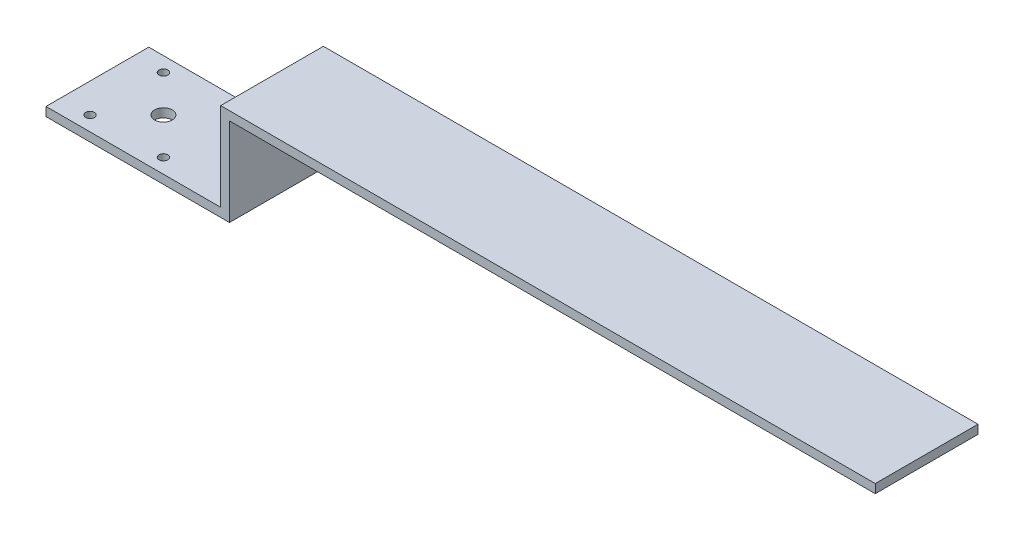
ISO-10303-21;
HEADER;
FILE_DESCRIPTION(('STEP AP214'),'2;1');
FILE_NAME('part.step','',(''),(''),'','','');
FILE_SCHEMA(('AUTOMOTIVE_DESIGN { 1 0 10303 214 1 1 1 1 }'));
ENDSEC;
DATA;
#1=APPLICATION_CONTEXT('core data for automotive mechanical design processes');
#2=APPLICATION_PROTOCOL_DEFINITION('international standard','automotive_design',2000,#1);
#3=PRODUCT_CONTEXT('',#1,'mechanical');
#4=PRODUCT('Part','Part','',(#3));
#5=PRODUCT_RELATED_PRODUCT_CATEGORY('part','',(#4));
#6=PRODUCT_DEFINITION_FORMATION('','',#4);
#7=PRODUCT_DEFINITION_CONTEXT('part definition',#1,'design');
#8=PRODUCT_DEFINITION('design','',#6,#7);
#9=PRODUCT_DEFINITION_SHAPE('','',#8);
#10=(LENGTH_UNIT() NAMED_UNIT(*) SI_UNIT(.MILLI.,.METRE.));
#11=(NAMED_UNIT(*) PLANE_ANGLE_UNIT() SI_UNIT($,.RADIAN.));
#12=(NAMED_UNIT(*) SI_UNIT($,.STERADIAN.) SOLID_ANGLE_UNIT());
#13=UNCERTAINTY_MEASURE_WITH_UNIT(LENGTH_MEASURE(1.E-05),#10,'distance_accuracy_value','');
#14=(GEOMETRIC_REPRESENTATION_CONTEXT(3) GLOBAL_UNCERTAINTY_ASSIGNED_CONTEXT((#13)) GLOBAL_UNIT_ASSIGNED_CONTEXT((#10,
#11,#12)) REPRESENTATION_CONTEXT('',''));
#15=CARTESIAN_POINT('',(0.,0.,0.));
#16=DIRECTION('',(0.,0.,1.));
#17=DIRECTION('',(1.,0.,0.));
#18=AXIS2_PLACEMENT_3D('',#15,#16,#17);
#19=CARTESIAN_POINT('',(31.25,3.,-17.5));
#20=DIRECTION('',(-1.,0.,0.));
#21=DIRECTION('',(0.,0.,1.));
#22=AXIS2_PLACEMENT_3D('',#19,#20,#21);
#23=PLANE('',#22);
#24=DIRECTION('',(0.,0.,-1.));
#25=VECTOR('',#24,1.);
#26=CARTESIAN_POINT('',(31.25,30.,17.5));
#27=LINE('',#26,#25);
#28=CARTESIAN_POINT('',(31.25,30.,17.5));
#29=VERTEX_POINT('',#28);
#30=CARTESIAN_POINT('',(31.25,30.,-17.5));
#31=VERTEX_POINT('',#30);
#32=EDGE_CURVE('E47',#29,#31,#27,.T.);
#33=ORIENTED_EDGE('',*,*,#32,.F.);
#34=DIRECTION('',(0.,-1.,0.));
#35=VECTOR('',#34,1.);
#36=CARTESIAN_POINT('',(31.25,3.,17.5));
#37=LINE('',#36,#35);
#38=CARTESIAN_POINT('',(31.25,0.,17.5));
#39=VERTEX_POINT('',#38);
#40=EDGE_CURVE('E119',#29,#39,#37,.T.);
#41=ORIENTED_EDGE('',*,*,#40,.T.);
#42=DIRECTION('',(0.,0.,-1.));
#43=VECTOR('',#42,1.);
#44=CARTESIAN_POINT('',(31.25,0.,-17.5));
#45=LINE('',#44,#43);
#46=CARTESIAN_POINT('',(31.25,0.,-17.5));
#47=VERTEX_POINT('',#46);
#48=EDGE_CURVE('E165',#39,#47,#45,.T.);
#49=ORIENTED_EDGE('',*,*,#48,.T.);
#50=DIRECTION('',(0.,-1.,0.));
#51=VECTOR('',#50,1.);
#52=CARTESIAN_POINT('',(31.25,3.,-17.5));
#53=LINE('',#52,#51);
#54=EDGE_CURVE('E11',#31,#47,#53,.T.);
#55=ORIENTED_EDGE('',*,*,#54,.F.);
#56=EDGE_LOOP('',(#33,#41,#49,#55));
#57=FACE_BOUND('',#56,.T.);
#58=ADVANCED_FACE('F33',(#57),#23,.F.);
#59=CARTESIAN_POINT('',(0.,3.,0.));
#60=DIRECTION('',(0.,1.,0.));
#61=DIRECTION('',(0.,0.,1.));
#62=AXIS2_PLACEMENT_3D('',#59,#60,#61);
#63=PLANE('',#62);
#64=DIRECTION('',(0.,0.,1.));
#65=VECTOR('',#64,1.);
#66=CARTESIAN_POINT('',(28.25,3.,-17.5));
#67=LINE('',#66,#65);
#68=CARTESIAN_POINT('',(28.25,3.,-17.5));
#69=VERTEX_POINT('',#68);
#70=CARTESIAN_POINT('',(28.25,3.,17.5));
#71=VERTEX_POINT('',#70);
#72=EDGE_CURVE('E55',#69,#71,#67,.T.);
#73=ORIENTED_EDGE('',*,*,#72,.F.);
#74=DIRECTION('',(-1.,0.,0.));
#75=VECTOR('',#74,1.);
#76=CARTESIAN_POINT('',(-31.25,3.,-17.5));
#77=LINE('',#76,#75);
#78=CARTESIAN_POINT('',(-31.25,3.,-17.5));
#79=VERTEX_POINT('',#78);
#80=EDGE_CURVE('E168',#69,#79,#77,.T.);
#81=ORIENTED_EDGE('',*,*,#80,.T.);
#82=DIRECTION('',(0.,0.,1.));
#83=VECTOR('',#82,1.);
#84=CARTESIAN_POINT('',(-31.25,3.,-17.5));
#85=LINE('',#84,#83);
#86=CARTESIAN_POINT('',(-31.25,3.,17.5));
#87=VERTEX_POINT('',#86);
#88=EDGE_CURVE('E170',#79,#87,#85,.T.);
#89=ORIENTED_EDGE('',*,*,#88,.T.);
#90=DIRECTION('',(1.,0.,0.));
#91=VECTOR('',#90,1.);
#92=CARTESIAN_POINT('',(-31.25,3.,17.5));
#93=LINE('',#92,#91);
#94=EDGE_CURVE('E173',#87,#71,#93,.T.);
#95=ORIENTED_EDGE('',*,*,#94,.T.);
#96=EDGE_LOOP('',(#73,#81,#89,#95));
#97=FACE_BOUND('',#96,.T.);
#98=CARTESIAN_POINT('',(3.75000000000001,3.,12.5));
#99=DIRECTION('',(0.,1.,0.));
#100=DIRECTION('',(0.,0.,1.));
#101=AXIS2_PLACEMENT_3D('',#98,#99,#100);
#102=CIRCLE('',#101,1.5);
#103=CARTESIAN_POINT('',(3.75000000000001,3.,14.));
#104=VERTEX_POINT('',#103);
#105=EDGE_CURVE('E144',#104,#104,#102,.T.);
#106=ORIENTED_EDGE('',*,*,#105,.F.);
#107=EDGE_LOOP('',(#106));
#108=FACE_BOUND('',#107,.T.);
#109=CARTESIAN_POINT('',(-21.25,3.,12.5));
#110=DIRECTION('',(0.,1.,0.));
#111=DIRECTION('',(0.,0.,1.));
#112=AXIS2_PLACEMENT_3D('',#109,#110,#111);
#113=CIRCLE('',#112,1.5);
#114=CARTESIAN_POINT('',(-21.25,3.,14.));
#115=VERTEX_POINT('',#114);
#116=EDGE_CURVE('E156',#115,#115,#113,.T.);
#117=ORIENTED_EDGE('',*,*,#116,.F.);
#118=EDGE_LOOP('',(#117));
#119=FACE_BOUND('',#118,.T.);
#120=CARTESIAN_POINT('',(-21.25,3.,-12.5));
#121=DIRECTION('',(0.,1.,0.));
#122=DIRECTION('',(0.,0.,1.));
#123=AXIS2_PLACEMENT_3D('',#120,#121,#122);
#124=CIRCLE('',#123,1.5);
#125=CARTESIAN_POINT('',(-21.25,3.,-11.));
#126=VERTEX_POINT('',#125);
#127=EDGE_CURVE('E162',#126,#126,#124,.T.);
#128=ORIENTED_EDGE('',*,*,#127,.F.);
#129=EDGE_LOOP('',(#128));
#130=FACE_BOUND('',#129,.T.);
#131=CARTESIAN_POINT('',(3.75,3.,-12.5));
#132=DIRECTION('',(0.,1.,0.));
#133=DIRECTION('',(0.,0.,1.));
#134=AXIS2_PLACEMENT_3D('',#131,#132,#133);
#135=CIRCLE('',#134,1.5);
#136=CARTESIAN_POINT('',(3.75,3.,-11.));
#137=VERTEX_POINT('',#136);
#138=EDGE_CURVE('E150',#137,#137,#135,.T.);
#139=ORIENTED_EDGE('',*,*,#138,.F.);
#140=EDGE_LOOP('',(#139));
#141=FACE_BOUND('',#140,.T.);
#142=CARTESIAN_POINT('',(-8.75,3.,0.));
#143=DIRECTION('',(0.,1.,0.));
#144=DIRECTION('',(0.,0.,1.));
#145=AXIS2_PLACEMENT_3D('',#142,#143,#144);
#146=CIRCLE('',#145,3.00000000000001);
#147=CARTESIAN_POINT('',(-8.75,3.,3.00000000000001));
#148=VERTEX_POINT('',#147);
#149=EDGE_CURVE('E138',#148,#148,#146,.T.);
#150=ORIENTED_EDGE('',*,*,#149,.F.);
#151=EDGE_LOOP('',(#150));
#152=FACE_BOUND('',#151,.T.);
#153=ADVANCED_FACE('F201',(#97,#108,#119,#130,#141,#152),#63,.T.);
#154=CARTESIAN_POINT('',(0.,0.,0.));
#155=DIRECTION('',(0.,1.,0.));
#156=DIRECTION('',(0.,0.,1.));
#157=AXIS2_PLACEMENT_3D('',#154,#155,#156);
#158=PLANE('',#157);
#159=ORIENTED_EDGE('',*,*,#48,.F.);
#160=DIRECTION('',(1.,0.,0.));
#161=VECTOR('',#160,1.);
#162=CARTESIAN_POINT('',(-31.25,0.,17.5));
#163=LINE('',#162,#161);
#164=CARTESIAN_POINT('',(-31.25,0.,17.5));
#165=VERTEX_POINT('',#164);
#166=EDGE_CURVE('E171',#165,#39,#163,.T.);
#167=ORIENTED_EDGE('',*,*,#166,.F.);
#168=DIRECTION('',(0.,0.,1.));
#169=VECTOR('',#168,1.);
#170=CARTESIAN_POINT('',(-31.25,0.,-17.5));
#171=LINE('',#170,#169);
#172=CARTESIAN_POINT('',(-31.25,0.,-17.5));
#173=VERTEX_POINT('',#172);
#174=EDGE_CURVE('E179',#173,#165,#171,.T.);
#175=ORIENTED_EDGE('',*,*,#174,.F.);
#176=DIRECTION('',(-1.,0.,0.));
#177=VECTOR('',#176,1.);
#178=CARTESIAN_POINT('',(-31.25,0.,-17.5));
#179=LINE('',#178,#177);
#180=EDGE_CURVE('E177',#47,#173,#179,.T.);
#181=ORIENTED_EDGE('',*,*,#180,.F.);
#182=EDGE_LOOP('',(#159,#167,#175,#181));
#183=FACE_BOUND('',#182,.T.);
#184=CARTESIAN_POINT('',(-21.25,0.,-12.5));
#185=DIRECTION('',(0.,1.,0.));
#186=DIRECTION('',(0.,0.,1.));
#187=AXIS2_PLACEMENT_3D('',#184,#185,#186);
#188=CIRCLE('',#187,1.5);
#189=CARTESIAN_POINT('',(-21.25,0.,-11.));
#190=VERTEX_POINT('',#189);
#191=EDGE_CURVE('E159',#190,#190,#188,.T.);
#192=ORIENTED_EDGE('',*,*,#191,.T.);
#193=EDGE_LOOP('',(#192));
#194=FACE_BOUND('',#193,.T.);
#195=CARTESIAN_POINT('',(-21.25,0.,12.5));
#196=DIRECTION('',(0.,1.,0.));
#197=DIRECTION('',(0.,0.,1.));
#198=AXIS2_PLACEMENT_3D('',#195,#196,#197);
#199=CIRCLE('',#198,1.5);
#200=CARTESIAN_POINT('',(-21.25,0.,14.));
#201=VERTEX_POINT('',#200);
#202=EDGE_CURVE('E153',#201,#201,#199,.T.);
#203=ORIENTED_EDGE('',*,*,#202,.T.);
#204=EDGE_LOOP('',(#203));
#205=FACE_BOUND('',#204,.T.);
#206=CARTESIAN_POINT('',(3.75,0.,-12.5));
#207=DIRECTION('',(0.,1.,0.));
#208=DIRECTION('',(0.,0.,1.));
#209=AXIS2_PLACEMENT_3D('',#206,#207,#208);
#210=CIRCLE('',#209,1.5);
#211=CARTESIAN_POINT('',(3.75,0.,-11.));
#212=VERTEX_POINT('',#211);
#213=EDGE_CURVE('E147',#212,#212,#210,.T.);
#214=ORIENTED_EDGE('',*,*,#213,.T.);
#215=EDGE_LOOP('',(#214));
#216=FACE_BOUND('',#215,.T.);
#217=CARTESIAN_POINT('',(3.75000000000001,0.,12.5));
#218=DIRECTION('',(0.,1.,0.));
#219=DIRECTION('',(0.,0.,1.));
#220=AXIS2_PLACEMENT_3D('',#217,#218,#219);
#221=CIRCLE('',#220,1.5);
#222=CARTESIAN_POINT('',(3.75000000000001,0.,14.));
#223=VERTEX_POINT('',#222);
#224=EDGE_CURVE('E141',#223,#223,#221,.T.);
#225=ORIENTED_EDGE('',*,*,#224,.T.);
#226=EDGE_LOOP('',(#225));
#227=FACE_BOUND('',#226,.T.);
#228=CARTESIAN_POINT('',(-8.75,0.,0.));
#229=DIRECTION('',(0.,1.,0.));
#230=DIRECTION('',(0.,0.,1.));
#231=AXIS2_PLACEMENT_3D('',#228,#229,#230);
#232=CIRCLE('',#231,3.00000000000001);
#233=CARTESIAN_POINT('',(-8.75,0.,3.00000000000001));
#234=VERTEX_POINT('',#233);
#235=EDGE_CURVE('E137',#234,#234,#232,.T.);
#236=ORIENTED_EDGE('',*,*,#235,.T.);
#237=EDGE_LOOP('',(#236));
#238=FACE_BOUND('',#237,.T.);
#239=ADVANCED_FACE('F197',(#183,#194,#205,#216,#227,#238),#158,.F.);
#240=CARTESIAN_POINT('',(-31.25,3.,-17.5));
#241=DIRECTION('',(0.,0.,1.));
#242=DIRECTION('',(1.,0.,0.));
#243=AXIS2_PLACEMENT_3D('',#240,#241,#242);
#244=PLANE('',#243);
#245=ORIENTED_EDGE('',*,*,#180,.T.);
#246=DIRECTION('',(0.,-1.,0.));
#247=VECTOR('',#246,1.);
#248=CARTESIAN_POINT('',(-31.25,3.,-17.5));
#249=LINE('',#248,#247);
#250=EDGE_CURVE('E40',#79,#173,#249,.T.);
#251=ORIENTED_EDGE('',*,*,#250,.F.);
#252=ORIENTED_EDGE('',*,*,#80,.F.);
#253=DIRECTION('',(0.,-1.,0.));
#254=VECTOR('',#253,1.);
#255=CARTESIAN_POINT('',(28.25,33.,-17.5));
#256=LINE('',#255,#254);
#257=CARTESIAN_POINT('',(28.25,33.,-17.5));
#258=VERTEX_POINT('',#257);
#259=EDGE_CURVE('E134',#258,#69,#256,.T.);
#260=ORIENTED_EDGE('',*,*,#259,.F.);
#261=DIRECTION('',(-1.,0.,0.));
#262=VECTOR('',#261,1.);
#263=CARTESIAN_POINT('',(31.25,33.,-17.5));
#264=LINE('',#263,#262);
#265=CARTESIAN_POINT('',(251.25,33.,-17.5));
#266=VERTEX_POINT('',#265);
#267=EDGE_CURVE('E121',#266,#258,#264,.T.);
#268=ORIENTED_EDGE('',*,*,#267,.F.);
#269=DIRECTION('',(0.,1.,0.));
#270=VECTOR('',#269,1.);
#271=CARTESIAN_POINT('',(251.25,33.,-17.5));
#272=LINE('',#271,#270);
#273=CARTESIAN_POINT('',(251.25,30.,-17.5));
#274=VERTEX_POINT('',#273);
#275=EDGE_CURVE('E106',#274,#266,#272,.T.);
#276=ORIENTED_EDGE('',*,*,#275,.F.);
#277=DIRECTION('',(-1.,0.,0.));
#278=VECTOR('',#277,1.);
#279=CARTESIAN_POINT('',(251.25,30.,-17.5));
#280=LINE('',#279,#278);
#281=EDGE_CURVE('E102',#274,#31,#280,.T.);
#282=ORIENTED_EDGE('',*,*,#281,.T.);
#283=ORIENTED_EDGE('',*,*,#54,.T.);
#284=EDGE_LOOP('',(#245,#251,#252,#260,#268,#276,#282,#283));
#285=FACE_BOUND('',#284,.T.);
#286=ADVANCED_FACE('F207',(#285),#244,.F.);
#287=CARTESIAN_POINT('',(-31.25,3.,-17.5));
#288=DIRECTION('',(1.,0.,0.));
#289=DIRECTION('',(0.,0.,-1.));
#290=AXIS2_PLACEMENT_3D('',#287,#288,#289);
#291=PLANE('',#290);
#292=ORIENTED_EDGE('',*,*,#174,.T.);
#293=DIRECTION('',(0.,-1.,0.));
#294=VECTOR('',#293,1.);
#295=CARTESIAN_POINT('',(-31.25,3.,17.5));
#296=LINE('',#295,#294);
#297=EDGE_CURVE('E183',#87,#165,#296,.T.);
#298=ORIENTED_EDGE('',*,*,#297,.F.);
#299=ORIENTED_EDGE('',*,*,#88,.F.);
#300=ORIENTED_EDGE('',*,*,#250,.T.);
#301=EDGE_LOOP('',(#292,#298,#299,#300));
#302=FACE_BOUND('',#301,.T.);
#303=ADVANCED_FACE('F190',(#302),#291,.F.);
#304=CARTESIAN_POINT('',(-31.25,3.,17.5));
#305=DIRECTION('',(0.,0.,-1.));
#306=DIRECTION('',(-1.,0.,0.));
#307=AXIS2_PLACEMENT_3D('',#304,#305,#306);
#308=PLANE('',#307);
#309=ORIENTED_EDGE('',*,*,#166,.T.);
#310=ORIENTED_EDGE('',*,*,#40,.F.);
#311=DIRECTION('',(-1.,0.,0.));
#312=VECTOR('',#311,1.);
#313=CARTESIAN_POINT('',(251.25,30.,17.5));
#314=LINE('',#313,#312);
#315=CARTESIAN_POINT('',(251.25,30.,17.5));
#316=VERTEX_POINT('',#315);
#317=EDGE_CURVE('E100',#316,#29,#314,.T.);
#318=ORIENTED_EDGE('',*,*,#317,.F.);
#319=DIRECTION('',(0.,-1.,0.));
#320=VECTOR('',#319,1.);
#321=CARTESIAN_POINT('',(251.25,33.,17.5));
#322=LINE('',#321,#320);
#323=CARTESIAN_POINT('',(251.25,33.,17.5));
#324=VERTEX_POINT('',#323);
#325=EDGE_CURVE('E107',#324,#316,#322,.T.);
#326=ORIENTED_EDGE('',*,*,#325,.F.);
#327=DIRECTION('',(1.,0.,0.));
#328=VECTOR('',#327,1.);
#329=CARTESIAN_POINT('',(31.25,33.,17.5));
#330=LINE('',#329,#328);
#331=CARTESIAN_POINT('',(28.25,33.,17.5));
#332=VERTEX_POINT('',#331);
#333=EDGE_CURVE('E129',#332,#324,#330,.T.);
#334=ORIENTED_EDGE('',*,*,#333,.F.);
#335=DIRECTION('',(0.,-1.,0.));
#336=VECTOR('',#335,1.);
#337=CARTESIAN_POINT('',(28.25,33.,17.5));
#338=LINE('',#337,#336);
#339=EDGE_CURVE('E130',#332,#71,#338,.T.);
#340=ORIENTED_EDGE('',*,*,#339,.T.);
#341=ORIENTED_EDGE('',*,*,#94,.F.);
#342=ORIENTED_EDGE('',*,*,#297,.T.);
#343=EDGE_LOOP('',(#309,#310,#318,#326,#334,#340,#341,#342));
#344=FACE_BOUND('',#343,.T.);
#345=ADVANCED_FACE('F118',(#344),#308,.F.);
#346=CARTESIAN_POINT('',(-21.25,3.,-12.5));
#347=DIRECTION('',(0.,-1.,0.));
#348=DIRECTION('',(0.,0.,-1.));
#349=AXIS2_PLACEMENT_3D('',#346,#347,#348);
#350=CYLINDRICAL_SURFACE('',#349,1.5);
#351=ORIENTED_EDGE('',*,*,#127,.T.);
#352=EDGE_LOOP('',(#351));
#353=FACE_BOUND('',#352,.T.);
#354=ORIENTED_EDGE('',*,*,#191,.F.);
#355=EDGE_LOOP('',(#354));
#356=FACE_BOUND('',#355,.T.);
#357=ADVANCED_FACE('F222',(#353,#356),#350,.F.);
#358=CARTESIAN_POINT('',(-21.25,3.,12.5));
#359=DIRECTION('',(0.,-1.,0.));
#360=DIRECTION('',(0.,0.,-1.));
#361=AXIS2_PLACEMENT_3D('',#358,#359,#360);
#362=CYLINDRICAL_SURFACE('',#361,1.5);
#363=ORIENTED_EDGE('',*,*,#116,.T.);
#364=EDGE_LOOP('',(#363));
#365=FACE_BOUND('',#364,.T.);
#366=ORIENTED_EDGE('',*,*,#202,.F.);
#367=EDGE_LOOP('',(#366));
#368=FACE_BOUND('',#367,.T.);
#369=ADVANCED_FACE('F248',(#365,#368),#362,.F.);
#370=CARTESIAN_POINT('',(3.75,3.,-12.5));
#371=DIRECTION('',(0.,-1.,0.));
#372=DIRECTION('',(0.,0.,-1.));
#373=AXIS2_PLACEMENT_3D('',#370,#371,#372);
#374=CYLINDRICAL_SURFACE('',#373,1.5);
#375=ORIENTED_EDGE('',*,*,#138,.T.);
#376=EDGE_LOOP('',(#375));
#377=FACE_BOUND('',#376,.T.);
#378=ORIENTED_EDGE('',*,*,#213,.F.);
#379=EDGE_LOOP('',(#378));
#380=FACE_BOUND('',#379,.T.);
#381=ADVANCED_FACE('F255',(#377,#380),#374,.F.);
#382=CARTESIAN_POINT('',(3.75000000000001,3.,12.5));
#383=DIRECTION('',(0.,-1.,0.));
#384=DIRECTION('',(0.,0.,-1.));
#385=AXIS2_PLACEMENT_3D('',#382,#383,#384);
#386=CYLINDRICAL_SURFACE('',#385,1.5);
#387=ORIENTED_EDGE('',*,*,#105,.T.);
#388=EDGE_LOOP('',(#387));
#389=FACE_BOUND('',#388,.T.);
#390=ORIENTED_EDGE('',*,*,#224,.F.);
#391=EDGE_LOOP('',(#390));
#392=FACE_BOUND('',#391,.T.);
#393=ADVANCED_FACE('F262',(#389,#392),#386,.F.);
#394=CARTESIAN_POINT('',(-8.75,3.,0.));
#395=DIRECTION('',(0.,-1.,0.));
#396=DIRECTION('',(0.,0.,-1.));
#397=AXIS2_PLACEMENT_3D('',#394,#395,#396);
#398=CYLINDRICAL_SURFACE('',#397,3.00000000000001);
#399=ORIENTED_EDGE('',*,*,#149,.T.);
#400=EDGE_LOOP('',(#399));
#401=FACE_BOUND('',#400,.T.);
#402=ORIENTED_EDGE('',*,*,#235,.F.);
#403=EDGE_LOOP('',(#402));
#404=FACE_BOUND('',#403,.T.);
#405=ADVANCED_FACE('F270',(#401,#404),#398,.F.);
#406=CARTESIAN_POINT('',(28.25,33.,-17.5));
#407=DIRECTION('',(1.,0.,0.));
#408=DIRECTION('',(0.,0.,-1.));
#409=AXIS2_PLACEMENT_3D('',#406,#407,#408);
#410=PLANE('',#409);
#411=ORIENTED_EDGE('',*,*,#72,.T.);
#412=ORIENTED_EDGE('',*,*,#339,.F.);
#413=DIRECTION('',(0.,0.,1.));
#414=VECTOR('',#413,1.);
#415=CARTESIAN_POINT('',(28.25,33.,-17.5));
#416=LINE('',#415,#414);
#417=EDGE_CURVE('E127',#258,#332,#416,.T.);
#418=ORIENTED_EDGE('',*,*,#417,.F.);
#419=ORIENTED_EDGE('',*,*,#259,.T.);
#420=EDGE_LOOP('',(#411,#412,#418,#419));
#421=FACE_BOUND('',#420,.T.);
#422=ADVANCED_FACE('F204',(#421),#410,.F.);
#423=CARTESIAN_POINT('',(0.,33.,0.));
#424=DIRECTION('',(0.,-1.,0.));
#425=DIRECTION('',(0.,0.,-1.));
#426=AXIS2_PLACEMENT_3D('',#423,#424,#425);
#427=PLANE('',#426);
#428=ORIENTED_EDGE('',*,*,#333,.T.);
#429=DIRECTION('',(0.,0.,1.));
#430=VECTOR('',#429,1.);
#431=CARTESIAN_POINT('',(251.25,33.,17.5));
#432=LINE('',#431,#430);
#433=EDGE_CURVE('E113',#266,#324,#432,.T.);
#434=ORIENTED_EDGE('',*,*,#433,.F.);
#435=ORIENTED_EDGE('',*,*,#267,.T.);
#436=ORIENTED_EDGE('',*,*,#417,.T.);
#437=EDGE_LOOP('',(#428,#434,#435,#436));
#438=FACE_BOUND('',#437,.T.);
#439=ADVANCED_FACE('F210',(#438),#427,.F.);
#440=CARTESIAN_POINT('',(251.25,30.,17.5));
#441=DIRECTION('',(0.,1.,0.));
#442=DIRECTION('',(0.,0.,1.));
#443=AXIS2_PLACEMENT_3D('',#440,#441,#442);
#444=PLANE('',#443);
#445=ORIENTED_EDGE('',*,*,#32,.T.);
#446=ORIENTED_EDGE('',*,*,#281,.F.);
#447=DIRECTION('',(0.,0.,-1.));
#448=VECTOR('',#447,1.);
#449=CARTESIAN_POINT('',(251.25,30.,17.5));
#450=LINE('',#449,#448);
#451=EDGE_CURVE('E96',#316,#274,#450,.T.);
#452=ORIENTED_EDGE('',*,*,#451,.F.);
#453=ORIENTED_EDGE('',*,*,#317,.T.);
#454=EDGE_LOOP('',(#445,#446,#452,#453));
#455=FACE_BOUND('',#454,.T.);
#456=ADVANCED_FACE('F98',(#455),#444,.F.);
#457=CARTESIAN_POINT('',(251.25,0.,0.));
#458=DIRECTION('',(1.,0.,0.));
#459=DIRECTION('',(0.,0.,-1.));
#460=AXIS2_PLACEMENT_3D('',#457,#458,#459);
#461=PLANE('',#460);
#462=ORIENTED_EDGE('',*,*,#325,.T.);
#463=ORIENTED_EDGE('',*,*,#451,.T.);
#464=ORIENTED_EDGE('',*,*,#275,.T.);
#465=ORIENTED_EDGE('',*,*,#433,.T.);
#466=EDGE_LOOP('',(#462,#463,#464,#465));
#467=FACE_BOUND('',#466,.T.);
#468=ADVANCED_FACE('F111',(#467),#461,.T.);
#469=CLOSED_SHELL('',(#58,#153,#239,#286,#303,#345,#357,#369,#381,#393,#405,#422,#439,#456,#468));
#470=MANIFOLD_SOLID_BREP('B2',#469);
#471=ADVANCED_BREP_SHAPE_REPRESENTATION('',(#18,#470),#14);
#472=SHAPE_DEFINITION_REPRESENTATION(#9,#471);
ENDSEC;
END-ISO-10303-21;
